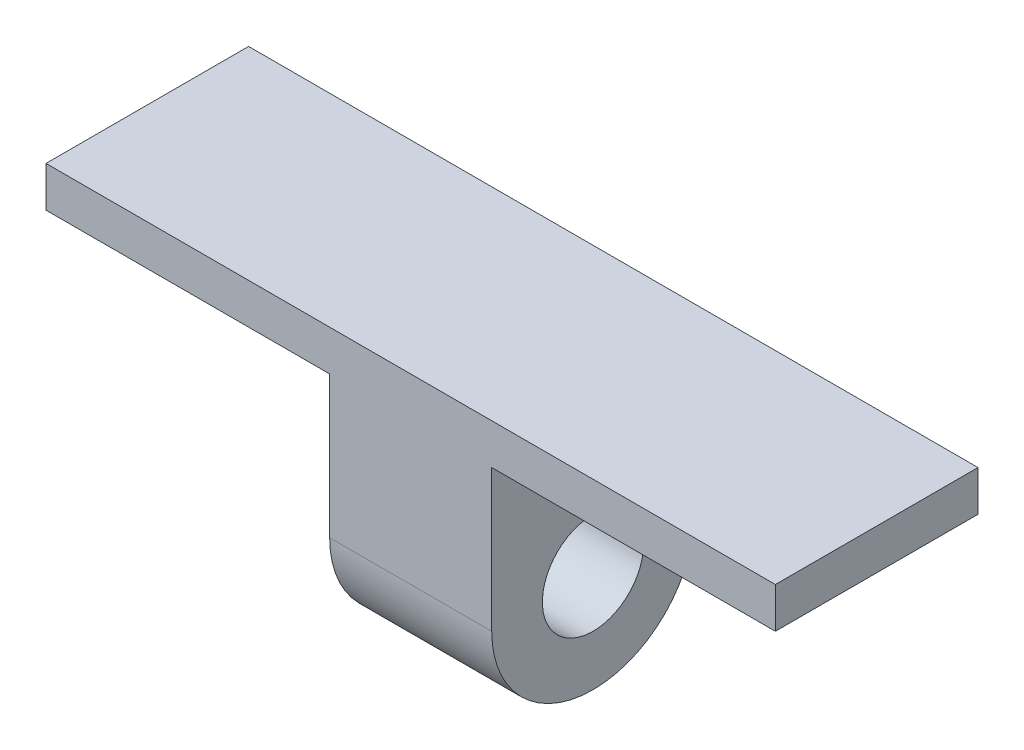
ISO-10303-21;
HEADER;
FILE_DESCRIPTION(('STEP AP214'),'2;1');
FILE_NAME('part.step','',(''),(''),'','','');
FILE_SCHEMA(('AUTOMOTIVE_DESIGN { 1 0 10303 214 1 1 1 1 }'));
ENDSEC;
DATA;
#1=APPLICATION_CONTEXT('core data for automotive mechanical design processes');
#2=APPLICATION_PROTOCOL_DEFINITION('international standard','automotive_design',2000,#1);
#3=PRODUCT_CONTEXT('',#1,'mechanical');
#4=PRODUCT('Part','Part','',(#3));
#5=PRODUCT_RELATED_PRODUCT_CATEGORY('part','',(#4));
#6=PRODUCT_DEFINITION_FORMATION('','',#4);
#7=PRODUCT_DEFINITION_CONTEXT('part definition',#1,'design');
#8=PRODUCT_DEFINITION('design','',#6,#7);
#9=PRODUCT_DEFINITION_SHAPE('','',#8);
#10=(LENGTH_UNIT() NAMED_UNIT(*) SI_UNIT(.MILLI.,.METRE.));
#11=(NAMED_UNIT(*) PLANE_ANGLE_UNIT() SI_UNIT($,.RADIAN.));
#12=(NAMED_UNIT(*) SI_UNIT($,.STERADIAN.) SOLID_ANGLE_UNIT());
#13=UNCERTAINTY_MEASURE_WITH_UNIT(LENGTH_MEASURE(1.E-05),#10,'distance_accuracy_value','');
#14=(GEOMETRIC_REPRESENTATION_CONTEXT(3) GLOBAL_UNCERTAINTY_ASSIGNED_CONTEXT((#13)) GLOBAL_UNIT_ASSIGNED_CONTEXT((#10,
#11,#12)) REPRESENTATION_CONTEXT('',''));
#15=CARTESIAN_POINT('',(0.,0.,0.));
#16=DIRECTION('',(0.,0.,1.));
#17=DIRECTION('',(1.,0.,0.));
#18=AXIS2_PLACEMENT_3D('',#15,#16,#17);
#19=CARTESIAN_POINT('',(0.,0.,0.));
#20=DIRECTION('',(0.,-1.,0.));
#21=DIRECTION('',(0.,0.,-1.));
#22=AXIS2_PLACEMENT_3D('',#19,#20,#21);
#23=PLANE('',#22);
#24=DIRECTION('',(0.,0.,1.));
#25=VECTOR('',#24,1.);
#26=CARTESIAN_POINT('',(110.,0.,0.));
#27=LINE('',#26,#25);
#28=CARTESIAN_POINT('',(110.,0.,0.));
#29=VERTEX_POINT('',#28);
#30=CARTESIAN_POINT('',(110.,0.,50.));
#31=VERTEX_POINT('',#30);
#32=EDGE_CURVE('E131',#29,#31,#27,.T.);
#33=ORIENTED_EDGE('',*,*,#32,.F.);
#34=DIRECTION('',(1.,0.,0.));
#35=VECTOR('',#34,1.);
#36=CARTESIAN_POINT('',(0.,0.,0.));
#37=LINE('',#36,#35);
#38=CARTESIAN_POINT('',(180.,0.,0.));
#39=VERTEX_POINT('',#38);
#40=EDGE_CURVE('E127',#29,#39,#37,.T.);
#41=ORIENTED_EDGE('',*,*,#40,.T.);
#42=DIRECTION('',(0.,0.,1.));
#43=VECTOR('',#42,1.);
#44=CARTESIAN_POINT('',(180.,0.,0.));
#45=LINE('',#44,#43);
#46=CARTESIAN_POINT('',(180.,0.,50.));
#47=VERTEX_POINT('',#46);
#48=EDGE_CURVE('E156',#39,#47,#45,.T.);
#49=ORIENTED_EDGE('',*,*,#48,.T.);
#50=DIRECTION('',(1.,0.,0.));
#51=VECTOR('',#50,1.);
#52=CARTESIAN_POINT('',(0.,0.,50.));
#53=LINE('',#52,#51);
#54=EDGE_CURVE('E142',#31,#47,#53,.T.);
#55=ORIENTED_EDGE('',*,*,#54,.F.);
#56=EDGE_LOOP('',(#33,#41,#49,#55));
#57=FACE_BOUND('',#56,.T.);
#58=ADVANCED_FACE('F39',(#57),#23,.T.);
#59=CARTESIAN_POINT('',(0.,10.,50.));
#60=DIRECTION('',(0.,0.,-1.));
#61=DIRECTION('',(-1.,0.,0.));
#62=AXIS2_PLACEMENT_3D('',#59,#60,#61);
#63=PLANE('',#62);
#64=DIRECTION('',(0.,1.,0.));
#65=VECTOR('',#64,1.);
#66=CARTESIAN_POINT('',(70.,-60.,50.));
#67=LINE('',#66,#65);
#68=CARTESIAN_POINT('',(70.,-35.,50.));
#69=VERTEX_POINT('',#68);
#70=CARTESIAN_POINT('',(70.,0.,50.));
#71=VERTEX_POINT('',#70);
#72=EDGE_CURVE('E116',#69,#71,#67,.T.);
#73=ORIENTED_EDGE('',*,*,#72,.F.);
#74=DIRECTION('',(-1.,0.,0.));
#75=VECTOR('',#74,1.);
#76=CARTESIAN_POINT('',(0.,-35.,50.));
#77=LINE('',#76,#75);
#78=CARTESIAN_POINT('',(110.,-35.,50.));
#79=VERTEX_POINT('',#78);
#80=EDGE_CURVE('E174',#69,#79,#77,.F.);
#81=ORIENTED_EDGE('',*,*,#80,.T.);
#82=DIRECTION('',(0.,1.,0.));
#83=VECTOR('',#82,1.);
#84=CARTESIAN_POINT('',(110.,-60.,50.));
#85=LINE('',#84,#83);
#86=EDGE_CURVE('E140',#79,#31,#85,.T.);
#87=ORIENTED_EDGE('',*,*,#86,.T.);
#88=ORIENTED_EDGE('',*,*,#54,.T.);
#89=DIRECTION('',(0.,-1.,0.));
#90=VECTOR('',#89,1.);
#91=CARTESIAN_POINT('',(180.,10.,50.));
#92=LINE('',#91,#90);
#93=CARTESIAN_POINT('',(180.,10.,50.));
#94=VERTEX_POINT('',#93);
#95=EDGE_CURVE('E167',#94,#47,#92,.T.);
#96=ORIENTED_EDGE('',*,*,#95,.F.);
#97=DIRECTION('',(1.,0.,0.));
#98=VECTOR('',#97,1.);
#99=CARTESIAN_POINT('',(0.,10.,50.));
#100=LINE('',#99,#98);
#101=CARTESIAN_POINT('',(0.,10.,50.));
#102=VERTEX_POINT('',#101);
#103=EDGE_CURVE('E143',#102,#94,#100,.T.);
#104=ORIENTED_EDGE('',*,*,#103,.F.);
#105=DIRECTION('',(0.,-1.,0.));
#106=VECTOR('',#105,1.);
#107=CARTESIAN_POINT('',(0.,10.,50.));
#108=LINE('',#107,#106);
#109=CARTESIAN_POINT('',(0.,0.,50.));
#110=VERTEX_POINT('',#109);
#111=EDGE_CURVE('E153',#102,#110,#108,.T.);
#112=ORIENTED_EDGE('',*,*,#111,.T.);
#113=EDGE_CURVE('E154',#110,#71,#53,.T.);
#114=ORIENTED_EDGE('',*,*,#113,.T.);
#115=EDGE_LOOP('',(#73,#81,#87,#88,#96,#104,#112,#114));
#116=FACE_BOUND('',#115,.T.);
#117=ADVANCED_FACE('F198',(#116),#63,.F.);
#118=CARTESIAN_POINT('',(180.,10.,0.));
#119=DIRECTION('',(1.,0.,0.));
#120=DIRECTION('',(0.,0.,-1.));
#121=AXIS2_PLACEMENT_3D('',#118,#119,#120);
#122=PLANE('',#121);
#123=ORIENTED_EDGE('',*,*,#48,.F.);
#124=DIRECTION('',(0.,-1.,0.));
#125=VECTOR('',#124,1.);
#126=CARTESIAN_POINT('',(180.,10.,0.));
#127=LINE('',#126,#125);
#128=CARTESIAN_POINT('',(180.,10.,0.));
#129=VERTEX_POINT('',#128);
#130=EDGE_CURVE('E164',#129,#39,#127,.T.);
#131=ORIENTED_EDGE('',*,*,#130,.F.);
#132=DIRECTION('',(0.,0.,1.));
#133=VECTOR('',#132,1.);
#134=CARTESIAN_POINT('',(180.,10.,0.));
#135=LINE('',#134,#133);
#136=EDGE_CURVE('E145',#129,#94,#135,.T.);
#137=ORIENTED_EDGE('',*,*,#136,.T.);
#138=ORIENTED_EDGE('',*,*,#95,.T.);
#139=EDGE_LOOP('',(#123,#131,#137,#138));
#140=FACE_BOUND('',#139,.T.);
#141=ADVANCED_FACE('F205',(#140),#122,.T.);
#142=CARTESIAN_POINT('',(0.,10.,0.));
#143=DIRECTION('',(0.,0.,-1.));
#144=DIRECTION('',(-1.,0.,0.));
#145=AXIS2_PLACEMENT_3D('',#142,#143,#144);
#146=PLANE('',#145);
#147=DIRECTION('',(0.,1.,0.));
#148=VECTOR('',#147,1.);
#149=CARTESIAN_POINT('',(110.,-60.,0.));
#150=LINE('',#149,#148);
#151=CARTESIAN_POINT('',(110.,-35.,0.));
#152=VERTEX_POINT('',#151);
#153=EDGE_CURVE('E117',#152,#29,#150,.T.);
#154=ORIENTED_EDGE('',*,*,#153,.F.);
#155=DIRECTION('',(1.,0.,0.));
#156=VECTOR('',#155,1.);
#157=CARTESIAN_POINT('',(70.,-35.,0.));
#158=LINE('',#157,#156);
#159=CARTESIAN_POINT('',(70.,-35.,0.));
#160=VERTEX_POINT('',#159);
#161=EDGE_CURVE('E11',#152,#160,#158,.F.);
#162=ORIENTED_EDGE('',*,*,#161,.T.);
#163=DIRECTION('',(0.,1.,0.));
#164=VECTOR('',#163,1.);
#165=CARTESIAN_POINT('',(70.,-60.,0.));
#166=LINE('',#165,#164);
#167=CARTESIAN_POINT('',(70.,0.,0.));
#168=VERTEX_POINT('',#167);
#169=EDGE_CURVE('E108',#160,#168,#166,.T.);
#170=ORIENTED_EDGE('',*,*,#169,.T.);
#171=CARTESIAN_POINT('',(0.,0.,0.));
#172=VERTEX_POINT('',#171);
#173=EDGE_CURVE('E111',#172,#168,#37,.T.);
#174=ORIENTED_EDGE('',*,*,#173,.F.);
#175=DIRECTION('',(0.,-1.,0.));
#176=VECTOR('',#175,1.);
#177=CARTESIAN_POINT('',(0.,10.,0.));
#178=LINE('',#177,#176);
#179=CARTESIAN_POINT('',(0.,10.,0.));
#180=VERTEX_POINT('',#179);
#181=EDGE_CURVE('E162',#180,#172,#178,.T.);
#182=ORIENTED_EDGE('',*,*,#181,.F.);
#183=DIRECTION('',(1.,0.,0.));
#184=VECTOR('',#183,1.);
#185=CARTESIAN_POINT('',(0.,10.,0.));
#186=LINE('',#185,#184);
#187=EDGE_CURVE('E148',#180,#129,#186,.T.);
#188=ORIENTED_EDGE('',*,*,#187,.T.);
#189=ORIENTED_EDGE('',*,*,#130,.T.);
#190=ORIENTED_EDGE('',*,*,#40,.F.);
#191=EDGE_LOOP('',(#154,#162,#170,#174,#182,#188,#189,#190));
#192=FACE_BOUND('',#191,.T.);
#193=ADVANCED_FACE('F110',(#192),#146,.T.);
#194=CARTESIAN_POINT('',(0.,10.,0.));
#195=DIRECTION('',(1.,0.,0.));
#196=DIRECTION('',(0.,0.,-1.));
#197=AXIS2_PLACEMENT_3D('',#194,#195,#196);
#198=PLANE('',#197);
#199=DIRECTION('',(0.,0.,1.));
#200=VECTOR('',#199,1.);
#201=CARTESIAN_POINT('',(0.,0.,0.));
#202=LINE('',#201,#200);
#203=EDGE_CURVE('E126',#172,#110,#202,.T.);
#204=ORIENTED_EDGE('',*,*,#203,.T.);
#205=ORIENTED_EDGE('',*,*,#111,.F.);
#206=DIRECTION('',(0.,0.,1.));
#207=VECTOR('',#206,1.);
#208=CARTESIAN_POINT('',(0.,10.,0.));
#209=LINE('',#208,#207);
#210=EDGE_CURVE('E151',#180,#102,#209,.T.);
#211=ORIENTED_EDGE('',*,*,#210,.F.);
#212=ORIENTED_EDGE('',*,*,#181,.T.);
#213=EDGE_LOOP('',(#204,#205,#211,#212));
#214=FACE_BOUND('',#213,.T.);
#215=ADVANCED_FACE('F214',(#214),#198,.F.);
#216=CARTESIAN_POINT('',(0.,10.,0.));
#217=DIRECTION('',(0.,-1.,0.));
#218=DIRECTION('',(0.,0.,-1.));
#219=AXIS2_PLACEMENT_3D('',#216,#217,#218);
#220=PLANE('',#219);
#221=ORIENTED_EDGE('',*,*,#103,.T.);
#222=ORIENTED_EDGE('',*,*,#136,.F.);
#223=ORIENTED_EDGE('',*,*,#187,.F.);
#224=ORIENTED_EDGE('',*,*,#210,.T.);
#225=EDGE_LOOP('',(#221,#222,#223,#224));
#226=FACE_BOUND('',#225,.T.);
#227=ADVANCED_FACE('F210',(#226),#220,.F.);
#228=DIRECTION('',(0.,0.,-1.));
#229=VECTOR('',#228,1.);
#230=CARTESIAN_POINT('',(70.,0.,0.));
#231=LINE('',#230,#229);
#232=EDGE_CURVE('E124',#71,#168,#231,.T.);
#233=ORIENTED_EDGE('',*,*,#232,.F.);
#234=ORIENTED_EDGE('',*,*,#113,.F.);
#235=ORIENTED_EDGE('',*,*,#203,.F.);
#236=ORIENTED_EDGE('',*,*,#173,.T.);
#237=EDGE_LOOP('',(#233,#234,#235,#236));
#238=FACE_BOUND('',#237,.T.);
#239=ADVANCED_FACE('F122',(#238),#23,.T.);
#240=CARTESIAN_POINT('',(110.,-60.,0.));
#241=DIRECTION('',(-1.,0.,0.));
#242=DIRECTION('',(0.,0.,1.));
#243=AXIS2_PLACEMENT_3D('',#240,#241,#242);
#244=PLANE('',#243);
#245=CARTESIAN_POINT('',(110.,-35.,25.));
#246=DIRECTION('',(1.,0.,0.));
#247=DIRECTION('',(0.,0.,-1.));
#248=AXIS2_PLACEMENT_3D('',#245,#246,#247);
#249=CIRCLE('',#248,12.5);
#250=CARTESIAN_POINT('',(110.,-35.,12.5));
#251=VERTEX_POINT('',#250);
#252=EDGE_CURVE('E183',#251,#251,#249,.T.);
#253=ORIENTED_EDGE('',*,*,#252,.F.);
#254=EDGE_LOOP('',(#253));
#255=FACE_BOUND('',#254,.T.);
#256=ORIENTED_EDGE('',*,*,#86,.F.);
#257=CARTESIAN_POINT('',(110.,-35.,25.));
#258=DIRECTION('',(-1.,0.,0.));
#259=DIRECTION('',(0.,0.,1.));
#260=AXIS2_PLACEMENT_3D('',#257,#258,#259);
#261=CIRCLE('',#260,25.);
#262=CARTESIAN_POINT('',(110.,-60.,25.));
#263=VERTEX_POINT('',#262);
#264=EDGE_CURVE('E48',#79,#263,#261,.F.);
#265=ORIENTED_EDGE('',*,*,#264,.T.);
#266=CARTESIAN_POINT('',(110.,-35.,25.));
#267=DIRECTION('',(-1.,0.,0.));
#268=DIRECTION('',(0.,0.,1.));
#269=AXIS2_PLACEMENT_3D('',#266,#267,#268);
#270=CIRCLE('',#269,25.);
#271=EDGE_CURVE('E56',#263,#152,#270,.F.);
#272=ORIENTED_EDGE('',*,*,#271,.T.);
#273=ORIENTED_EDGE('',*,*,#153,.T.);
#274=ORIENTED_EDGE('',*,*,#32,.T.);
#275=EDGE_LOOP('',(#256,#265,#272,#273,#274));
#276=FACE_BOUND('',#275,.T.);
#277=ADVANCED_FACE('F192',(#255,#276),#244,.F.);
#278=CARTESIAN_POINT('',(70.,-60.,0.));
#279=DIRECTION('',(1.,0.,0.));
#280=DIRECTION('',(0.,0.,-1.));
#281=AXIS2_PLACEMENT_3D('',#278,#279,#280);
#282=PLANE('',#281);
#283=CARTESIAN_POINT('',(70.,-35.,25.));
#284=DIRECTION('',(1.,0.,0.));
#285=DIRECTION('',(0.,0.,-1.));
#286=AXIS2_PLACEMENT_3D('',#283,#284,#285);
#287=CIRCLE('',#286,12.5);
#288=CARTESIAN_POINT('',(70.,-35.,12.5));
#289=VERTEX_POINT('',#288);
#290=EDGE_CURVE('E43',#289,#289,#287,.T.);
#291=ORIENTED_EDGE('',*,*,#290,.T.);
#292=EDGE_LOOP('',(#291));
#293=FACE_BOUND('',#292,.T.);
#294=CARTESIAN_POINT('',(70.,-35.,25.));
#295=DIRECTION('',(1.,0.,0.));
#296=DIRECTION('',(0.,0.,-1.));
#297=AXIS2_PLACEMENT_3D('',#294,#295,#296);
#298=CIRCLE('',#297,25.);
#299=CARTESIAN_POINT('',(70.,-60.,25.));
#300=VERTEX_POINT('',#299);
#301=EDGE_CURVE('E170',#160,#300,#298,.F.);
#302=ORIENTED_EDGE('',*,*,#301,.T.);
#303=CARTESIAN_POINT('',(70.,-35.,25.));
#304=DIRECTION('',(1.,0.,0.));
#305=DIRECTION('',(0.,0.,-1.));
#306=AXIS2_PLACEMENT_3D('',#303,#304,#305);
#307=CIRCLE('',#306,25.);
#308=EDGE_CURVE('E172',#300,#69,#307,.F.);
#309=ORIENTED_EDGE('',*,*,#308,.T.);
#310=ORIENTED_EDGE('',*,*,#72,.T.);
#311=ORIENTED_EDGE('',*,*,#232,.T.);
#312=ORIENTED_EDGE('',*,*,#169,.F.);
#313=EDGE_LOOP('',(#302,#309,#310,#311,#312));
#314=FACE_BOUND('',#313,.T.);
#315=ADVANCED_FACE('F129',(#293,#314),#282,.F.);
#316=CARTESIAN_POINT('',(0.,-35.,25.));
#317=DIRECTION('',(-1.,0.,0.));
#318=DIRECTION('',(0.,0.,1.));
#319=AXIS2_PLACEMENT_3D('',#316,#317,#318);
#320=CYLINDRICAL_SURFACE('',#319,25.);
#321=ORIENTED_EDGE('',*,*,#161,.F.);
#322=ORIENTED_EDGE('',*,*,#271,.F.);
#323=DIRECTION('',(1.,0.,0.));
#324=VECTOR('',#323,1.);
#325=CARTESIAN_POINT('',(110.,-60.,25.));
#326=LINE('',#325,#324);
#327=EDGE_CURVE('E135',#300,#263,#326,.T.);
#328=ORIENTED_EDGE('',*,*,#327,.F.);
#329=ORIENTED_EDGE('',*,*,#301,.F.);
#330=EDGE_LOOP('',(#321,#322,#328,#329));
#331=FACE_BOUND('',#330,.T.);
#332=ADVANCED_FACE('F41',(#331),#320,.T.);
#333=CARTESIAN_POINT('',(0.,-35.,25.));
#334=DIRECTION('',(-1.,0.,0.));
#335=DIRECTION('',(0.,0.,1.));
#336=AXIS2_PLACEMENT_3D('',#333,#334,#335);
#337=CYLINDRICAL_SURFACE('',#336,25.);
#338=ORIENTED_EDGE('',*,*,#264,.F.);
#339=ORIENTED_EDGE('',*,*,#80,.F.);
#340=ORIENTED_EDGE('',*,*,#308,.F.);
#341=ORIENTED_EDGE('',*,*,#327,.T.);
#342=EDGE_LOOP('',(#338,#339,#340,#341));
#343=FACE_BOUND('',#342,.T.);
#344=ADVANCED_FACE('F216',(#343),#337,.T.);
#345=CARTESIAN_POINT('',(0.,-35.,25.0000000000001));
#346=DIRECTION('',(1.,0.,0.));
#347=DIRECTION('',(0.,0.,-1.));
#348=AXIS2_PLACEMENT_3D('',#345,#346,#347);
#349=CYLINDRICAL_SURFACE('',#348,12.5);
#350=ORIENTED_EDGE('',*,*,#252,.T.);
#351=EDGE_LOOP('',(#350));
#352=FACE_BOUND('',#351,.T.);
#353=ORIENTED_EDGE('',*,*,#290,.F.);
#354=EDGE_LOOP('',(#353));
#355=FACE_BOUND('',#354,.T.);
#356=ADVANCED_FACE('F189',(#352,#355),#349,.F.);
#357=CLOSED_SHELL('',(#58,#117,#141,#193,#215,#227,#239,#277,#315,#332,#344,#356));
#358=MANIFOLD_SOLID_BREP('B2',#357);
#359=ADVANCED_BREP_SHAPE_REPRESENTATION('',(#18,#358),#14);
#360=SHAPE_DEFINITION_REPRESENTATION(#9,#359);
ENDSEC;
END-ISO-10303-21;
